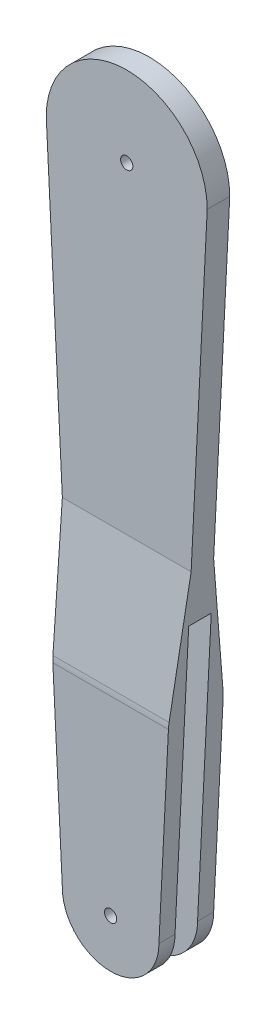
ISO-10303-21;
HEADER;
FILE_DESCRIPTION(('STEP AP214'),'2;1');
FILE_NAME('part.step','',(''),(''),'','','');
FILE_SCHEMA(('AUTOMOTIVE_DESIGN { 1 0 10303 214 1 1 1 1 }'));
ENDSEC;
DATA;
#1=APPLICATION_CONTEXT('core data for automotive mechanical design processes');
#2=APPLICATION_PROTOCOL_DEFINITION('international standard','automotive_design',2000,#1);
#3=PRODUCT_CONTEXT('',#1,'mechanical');
#4=PRODUCT('Part','Part','',(#3));
#5=PRODUCT_RELATED_PRODUCT_CATEGORY('part','',(#4));
#6=PRODUCT_DEFINITION_FORMATION('','',#4);
#7=PRODUCT_DEFINITION_CONTEXT('part definition',#1,'design');
#8=PRODUCT_DEFINITION('design','',#6,#7);
#9=PRODUCT_DEFINITION_SHAPE('','',#8);
#10=(LENGTH_UNIT() NAMED_UNIT(*) SI_UNIT(.MILLI.,.METRE.));
#11=(NAMED_UNIT(*) PLANE_ANGLE_UNIT() SI_UNIT($,.RADIAN.));
#12=(NAMED_UNIT(*) SI_UNIT($,.STERADIAN.) SOLID_ANGLE_UNIT());
#13=UNCERTAINTY_MEASURE_WITH_UNIT(LENGTH_MEASURE(1.E-05),#10,'distance_accuracy_value','');
#14=(GEOMETRIC_REPRESENTATION_CONTEXT(3) GLOBAL_UNCERTAINTY_ASSIGNED_CONTEXT((#13)) GLOBAL_UNIT_ASSIGNED_CONTEXT((#10,
#11,#12)) REPRESENTATION_CONTEXT('',''));
#15=CARTESIAN_POINT('',(0.,0.,0.));
#16=DIRECTION('',(0.,0.,1.));
#17=DIRECTION('',(1.,0.,0.));
#18=AXIS2_PLACEMENT_3D('',#15,#16,#17);
#19=CARTESIAN_POINT('',(-24.9376558603491,-1.24688279301746,7.));
#20=DIRECTION('',(-0.998752338877845,-0.0499376169438922,0.));
#21=DIRECTION('',(0.0499376169438922,-0.998752338877845,0.));
#22=AXIS2_PLACEMENT_3D('',#19,#20,#21);
#23=PLANE('',#22);
#24=DIRECTION('',(0.,0.,-1.));
#25=VECTOR('',#24,1.);
#26=CARTESIAN_POINT('',(-15.,-200.,7.));
#27=LINE('',#26,#25);
#28=CARTESIAN_POINT('',(-15.,-200.,0.));
#29=VERTEX_POINT('',#28);
#30=CARTESIAN_POINT('',(-15.,-200.,-5.));
#31=VERTEX_POINT('',#30);
#32=EDGE_CURVE('E293',#29,#31,#27,.T.);
#33=ORIENTED_EDGE('',*,*,#32,.F.);
#34=DIRECTION('',(-0.0499376169438922,0.998752338877845,0.));
#35=VECTOR('',#34,1.);
#36=CARTESIAN_POINT('',(-24.9376558603491,-1.24688279301746,0.));
#37=LINE('',#36,#35);
#38=CARTESIAN_POINT('',(-19.25,-115.,0.));
#39=VERTEX_POINT('',#38);
#40=EDGE_CURVE('E225',#29,#39,#37,.T.);
#41=ORIENTED_EDGE('',*,*,#40,.T.);
#42=DIRECTION('',(0.,0.,1.));
#43=VECTOR('',#42,1.);
#44=CARTESIAN_POINT('',(-19.25,-115.,7.));
#45=LINE('',#44,#43);
#46=CARTESIAN_POINT('',(-19.25,-115.,7.));
#47=VERTEX_POINT('',#46);
#48=EDGE_CURVE('E217',#39,#47,#45,.T.);
#49=ORIENTED_EDGE('',*,*,#48,.T.);
#50=DIRECTION('',(0.0499376169438922,-0.998752338877845,0.));
#51=VECTOR('',#50,1.);
#52=CARTESIAN_POINT('',(-24.9376558603491,-1.24688279301746,7.));
#53=LINE('',#52,#51);
#54=CARTESIAN_POINT('',(-15.,-200.,7.));
#55=VERTEX_POINT('',#54);
#56=EDGE_CURVE('E204',#47,#55,#53,.T.);
#57=ORIENTED_EDGE('',*,*,#56,.T.);
#58=CARTESIAN_POINT('',(-15.,-200.,12.));
#59=VERTEX_POINT('',#58);
#60=EDGE_CURVE('E302',#59,#55,#27,.T.);
#61=ORIENTED_EDGE('',*,*,#60,.F.);
#62=DIRECTION('',(0.0499376169438922,-0.998752338877845,0.));
#63=VECTOR('',#62,1.);
#64=CARTESIAN_POINT('',(-14.1620947630923,-216.758104738155,12.));
#65=LINE('',#64,#63);
#66=CARTESIAN_POINT('',(-17.9533066887761,-140.933866224478,12.));
#67=VERTEX_POINT('',#66);
#68=EDGE_CURVE('E126',#67,#59,#65,.T.);
#69=ORIENTED_EDGE('',*,*,#68,.F.);
#70=CARTESIAN_POINT('',(-17.9533066887761,-140.933866224478,-3.));
#71=DIRECTION('',(0.998752338877845,0.0499376169438922,0.));
#72=DIRECTION('',(-0.0499376169438922,0.998752338877845,0.));
#73=AXIS2_PLACEMENT_3D('',#70,#71,#72);
#74=ELLIPSE('',#73,15.0187382958756,15.);
#75=CARTESIAN_POINT('',(-18.046332739718,-139.07334520564,11.884168150705));
#76=VERTEX_POINT('',#75);
#77=EDGE_CURVE('E111',#67,#76,#74,.F.);
#78=ORIENTED_EDGE('',*,*,#77,.T.);
#79=DIRECTION('',(0.0495529430831444,-0.991058861662888,0.123882357707861));
#80=VECTOR('',#79,1.);
#81=CARTESIAN_POINT('',(-17.9042357274402,-141.915285451197,12.2394106813996));
#82=LINE('',#81,#80);
#83=CARTESIAN_POINT('',(-20.,-100.,7.));
#84=VERTEX_POINT('',#83);
#85=EDGE_CURVE('E227',#84,#76,#82,.T.);
#86=ORIENTED_EDGE('',*,*,#85,.F.);
#87=DIRECTION('',(-0.0499376169438922,0.998752338877845,0.));
#88=VECTOR('',#87,1.);
#89=CARTESIAN_POINT('',(-24.9376558603491,-1.24688279301746,7.));
#90=LINE('',#89,#88);
#91=CARTESIAN_POINT('',(-25.,0.,7.));
#92=VERTEX_POINT('',#91);
#93=EDGE_CURVE('E290',#84,#92,#90,.T.);
#94=ORIENTED_EDGE('',*,*,#93,.T.);
#95=DIRECTION('',(0.,0.,-1.));
#96=VECTOR('',#95,1.);
#97=CARTESIAN_POINT('',(-25.,0.,7.));
#98=LINE('',#97,#96);
#99=CARTESIAN_POINT('',(-25.,0.,0.));
#100=VERTEX_POINT('',#99);
#101=EDGE_CURVE('E305',#92,#100,#98,.T.);
#102=ORIENTED_EDGE('',*,*,#101,.T.);
#103=DIRECTION('',(-0.0499376169438922,0.998752338877845,0.));
#104=VECTOR('',#103,1.);
#105=CARTESIAN_POINT('',(-24.9376558603491,-1.24688279301746,0.));
#106=LINE('',#105,#104);
#107=CARTESIAN_POINT('',(-20.,-100.,0.));
#108=VERTEX_POINT('',#107);
#109=EDGE_CURVE('E286',#108,#100,#106,.T.);
#110=ORIENTED_EDGE('',*,*,#109,.F.);
#111=DIRECTION('',(-0.0495529430831444,0.991058861662888,0.123882357707861));
#112=VECTOR('',#111,1.);
#113=CARTESIAN_POINT('',(-17.9042357274402,-141.915285451197,-5.23941068139963));
#114=LINE('',#113,#112);
#115=CARTESIAN_POINT('',(-18.046332739718,-139.07334520564,-4.88416815070502));
#116=VERTEX_POINT('',#115);
#117=EDGE_CURVE('E250',#116,#108,#114,.T.);
#118=ORIENTED_EDGE('',*,*,#117,.F.);
#119=CARTESIAN_POINT('',(-17.9533066887761,-140.933866224478,10.));
#120=DIRECTION('',(-0.998752338877845,-0.0499376169438922,0.));
#121=DIRECTION('',(-0.0499376169438922,0.998752338877845,0.));
#122=AXIS2_PLACEMENT_3D('',#119,#120,#121);
#123=ELLIPSE('',#122,15.0187382958756,15.);
#124=CARTESIAN_POINT('',(-17.9533066887761,-140.933866224478,-5.));
#125=VERTEX_POINT('',#124);
#126=EDGE_CURVE('E320',#116,#125,#123,.T.);
#127=ORIENTED_EDGE('',*,*,#126,.T.);
#128=DIRECTION('',(-0.0499376169438922,0.998752338877845,0.));
#129=VECTOR('',#128,1.);
#130=CARTESIAN_POINT('',(-14.1620947630923,-216.758104738155,-5.));
#131=LINE('',#130,#129);
#132=EDGE_CURVE('E259',#31,#125,#131,.T.);
#133=ORIENTED_EDGE('',*,*,#132,.F.);
#134=EDGE_LOOP('',(#33,#41,#49,#57,#61,#69,#78,#86,#94,#102,#110,#118,#127,#133));
#135=FACE_BOUND('',#134,.T.);
#136=ADVANCED_FACE('F101',(#135),#23,.T.);
#137=CARTESIAN_POINT('',(24.9376558603491,-1.24688279301746,7.));
#138=DIRECTION('',(-0.998752338877845,0.0499376169438923,0.));
#139=DIRECTION('',(-0.0499376169438923,-0.998752338877845,0.));
#140=AXIS2_PLACEMENT_3D('',#137,#138,#139);
#141=PLANE('',#140);
#142=DIRECTION('',(0.0499376169438923,0.998752338877845,0.));
#143=VECTOR('',#142,1.);
#144=CARTESIAN_POINT('',(24.9376558603491,-1.24688279301746,0.));
#145=LINE('',#144,#143);
#146=CARTESIAN_POINT('',(15.,-200.,0.));
#147=VERTEX_POINT('',#146);
#148=CARTESIAN_POINT('',(19.25,-115.,0.));
#149=VERTEX_POINT('',#148);
#150=EDGE_CURVE('E233',#147,#149,#145,.T.);
#151=ORIENTED_EDGE('',*,*,#150,.F.);
#152=DIRECTION('',(0.,0.,-1.));
#153=VECTOR('',#152,1.);
#154=CARTESIAN_POINT('',(15.,-200.,7.));
#155=LINE('',#154,#153);
#156=CARTESIAN_POINT('',(15.,-200.,-5.));
#157=VERTEX_POINT('',#156);
#158=EDGE_CURVE('E313',#147,#157,#155,.T.);
#159=ORIENTED_EDGE('',*,*,#158,.T.);
#160=DIRECTION('',(-0.0499376169438923,-0.998752338877845,0.));
#161=VECTOR('',#160,1.);
#162=CARTESIAN_POINT('',(14.2668329177057,-214.663341645885,-5.));
#163=LINE('',#162,#161);
#164=CARTESIAN_POINT('',(17.9533066887761,-140.933866224478,-5.));
#165=VERTEX_POINT('',#164);
#166=EDGE_CURVE('E267',#165,#157,#163,.T.);
#167=ORIENTED_EDGE('',*,*,#166,.F.);
#168=CARTESIAN_POINT('',(17.9533066887761,-140.933866224478,10.));
#169=DIRECTION('',(-0.998752338877845,0.0499376169438923,0.));
#170=DIRECTION('',(-0.0499376169438923,-0.998752338877845,0.));
#171=AXIS2_PLACEMENT_3D('',#168,#169,#170);
#172=ELLIPSE('',#171,15.0187382958756,15.);
#173=CARTESIAN_POINT('',(18.046332739718,-139.07334520564,-4.88416815070502));
#174=VERTEX_POINT('',#173);
#175=EDGE_CURVE('E256',#165,#174,#172,.F.);
#176=ORIENTED_EDGE('',*,*,#175,.T.);
#177=DIRECTION('',(-0.0495529430831445,-0.991058861662888,-0.123882357707861));
#178=VECTOR('',#177,1.);
#179=CARTESIAN_POINT('',(18.0073664825046,-139.852670349908,-4.98158379373849));
#180=LINE('',#179,#178);
#181=CARTESIAN_POINT('',(20.,-100.,0.));
#182=VERTEX_POINT('',#181);
#183=EDGE_CURVE('E263',#182,#174,#180,.T.);
#184=ORIENTED_EDGE('',*,*,#183,.F.);
#185=DIRECTION('',(0.0499376169438923,0.998752338877845,0.));
#186=VECTOR('',#185,1.);
#187=CARTESIAN_POINT('',(24.9376558603491,-1.24688279301746,0.));
#188=LINE('',#187,#186);
#189=CARTESIAN_POINT('',(25.,0.,0.));
#190=VERTEX_POINT('',#189);
#191=EDGE_CURVE('E275',#182,#190,#188,.T.);
#192=ORIENTED_EDGE('',*,*,#191,.T.);
#193=DIRECTION('',(0.,0.,-1.));
#194=VECTOR('',#193,1.);
#195=CARTESIAN_POINT('',(25.,0.,7.));
#196=LINE('',#195,#194);
#197=CARTESIAN_POINT('',(25.,0.,7.));
#198=VERTEX_POINT('',#197);
#199=EDGE_CURVE('E309',#198,#190,#196,.T.);
#200=ORIENTED_EDGE('',*,*,#199,.F.);
#201=DIRECTION('',(0.0499376169438923,0.998752338877845,0.));
#202=VECTOR('',#201,1.);
#203=CARTESIAN_POINT('',(24.9376558603491,-1.24688279301746,7.));
#204=LINE('',#203,#202);
#205=CARTESIAN_POINT('',(20.,-100.,7.));
#206=VERTEX_POINT('',#205);
#207=EDGE_CURVE('E282',#206,#198,#204,.T.);
#208=ORIENTED_EDGE('',*,*,#207,.F.);
#209=DIRECTION('',(0.0495529430831445,0.991058861662888,-0.123882357707861));
#210=VECTOR('',#209,1.);
#211=CARTESIAN_POINT('',(18.0073664825046,-139.852670349908,11.9815837937385));
#212=LINE('',#211,#210);
#213=CARTESIAN_POINT('',(18.046332739718,-139.07334520564,11.884168150705));
#214=VERTEX_POINT('',#213);
#215=EDGE_CURVE('E243',#214,#206,#212,.T.);
#216=ORIENTED_EDGE('',*,*,#215,.F.);
#217=CARTESIAN_POINT('',(17.9533066887761,-140.933866224478,-3.));
#218=DIRECTION('',(-0.998752338877845,0.0499376169438923,0.));
#219=DIRECTION('',(-0.0499376169438923,-0.998752338877845,0.));
#220=AXIS2_PLACEMENT_3D('',#217,#218,#219);
#221=ELLIPSE('',#220,15.0187382958756,15.);
#222=CARTESIAN_POINT('',(17.9533066887761,-140.933866224478,12.));
#223=VERTEX_POINT('',#222);
#224=EDGE_CURVE('E334',#214,#223,#221,.F.);
#225=ORIENTED_EDGE('',*,*,#224,.T.);
#226=DIRECTION('',(0.0499376169438923,0.998752338877845,0.));
#227=VECTOR('',#226,1.);
#228=CARTESIAN_POINT('',(14.2668329177057,-214.663341645885,12.));
#229=LINE('',#228,#227);
#230=CARTESIAN_POINT('',(15.,-200.,12.));
#231=VERTEX_POINT('',#230);
#232=EDGE_CURVE('E239',#231,#223,#229,.T.);
#233=ORIENTED_EDGE('',*,*,#232,.F.);
#234=CARTESIAN_POINT('',(15.,-200.,7.));
#235=VERTEX_POINT('',#234);
#236=EDGE_CURVE('E281',#231,#235,#155,.T.);
#237=ORIENTED_EDGE('',*,*,#236,.T.);
#238=DIRECTION('',(-0.0499376169438923,-0.998752338877845,0.));
#239=VECTOR('',#238,1.);
#240=CARTESIAN_POINT('',(24.9376558603491,-1.24688279301746,7.));
#241=LINE('',#240,#239);
#242=CARTESIAN_POINT('',(19.25,-115.,7.));
#243=VERTEX_POINT('',#242);
#244=EDGE_CURVE('E212',#243,#235,#241,.T.);
#245=ORIENTED_EDGE('',*,*,#244,.F.);
#246=DIRECTION('',(0.,0.,1.));
#247=VECTOR('',#246,1.);
#248=CARTESIAN_POINT('',(19.25,-115.,7.));
#249=LINE('',#248,#247);
#250=EDGE_CURVE('E12',#149,#243,#249,.T.);
#251=ORIENTED_EDGE('',*,*,#250,.F.);
#252=EDGE_LOOP('',(#151,#159,#167,#176,#184,#192,#200,#208,#216,#225,#233,#237,#245,#251));
#253=FACE_BOUND('',#252,.T.);
#254=ADVANCED_FACE('F350',(#253),#141,.F.);
#255=CARTESIAN_POINT('',(0.,-200.,7.));
#256=DIRECTION('',(0.,0.,-1.));
#257=DIRECTION('',(-1.,0.,0.));
#258=AXIS2_PLACEMENT_3D('',#255,#256,#257);
#259=CYLINDRICAL_SURFACE('',#258,15.);
#260=ORIENTED_EDGE('',*,*,#158,.F.);
#261=CARTESIAN_POINT('',(0.,-200.,0.));
#262=DIRECTION('',(0.,0.,1.));
#263=DIRECTION('',(1.,0.,0.));
#264=AXIS2_PLACEMENT_3D('',#261,#262,#263);
#265=CIRCLE('',#264,15.);
#266=EDGE_CURVE('E211',#29,#147,#265,.T.);
#267=ORIENTED_EDGE('',*,*,#266,.F.);
#268=ORIENTED_EDGE('',*,*,#32,.T.);
#269=CARTESIAN_POINT('',(0.,-200.,-5.));
#270=DIRECTION('',(0.,0.,-1.));
#271=DIRECTION('',(0.,1.,0.));
#272=AXIS2_PLACEMENT_3D('',#269,#270,#271);
#273=CIRCLE('',#272,15.);
#274=EDGE_CURVE('E271',#157,#31,#273,.T.);
#275=ORIENTED_EDGE('',*,*,#274,.F.);
#276=EDGE_LOOP('',(#260,#267,#268,#275));
#277=FACE_BOUND('',#276,.T.);
#278=ADVANCED_FACE('F410',(#277),#259,.T.);
#279=CARTESIAN_POINT('',(0.,-200.,7.));
#280=DIRECTION('',(0.,0.,-1.));
#281=DIRECTION('',(-1.,0.,0.));
#282=AXIS2_PLACEMENT_3D('',#279,#280,#281);
#283=CIRCLE('',#282,15.);
#284=EDGE_CURVE('E118',#235,#55,#283,.T.);
#285=ORIENTED_EDGE('',*,*,#284,.F.);
#286=ORIENTED_EDGE('',*,*,#236,.F.);
#287=CARTESIAN_POINT('',(0.,-200.,12.));
#288=DIRECTION('',(0.,0.,-1.));
#289=DIRECTION('',(0.,1.,0.));
#290=AXIS2_PLACEMENT_3D('',#287,#288,#289);
#291=CIRCLE('',#290,15.);
#292=EDGE_CURVE('E246',#59,#231,#291,.F.);
#293=ORIENTED_EDGE('',*,*,#292,.F.);
#294=ORIENTED_EDGE('',*,*,#60,.T.);
#295=EDGE_LOOP('',(#285,#286,#293,#294));
#296=FACE_BOUND('',#295,.T.);
#297=ADVANCED_FACE('F354',(#296),#259,.T.);
#298=CARTESIAN_POINT('',(21.,-215.,12.));
#299=DIRECTION('',(0.,0.,-1.));
#300=DIRECTION('',(0.,1.,0.));
#301=AXIS2_PLACEMENT_3D('',#298,#299,#300);
#302=PLANE('',#301);
#303=CARTESIAN_POINT('',(0.,-200.,12.));
#304=DIRECTION('',(0.,0.,-1.));
#305=DIRECTION('',(0.,1.,0.));
#306=AXIS2_PLACEMENT_3D('',#303,#304,#305);
#307=CIRCLE('',#306,1.90000000000001);
#308=CARTESIAN_POINT('',(0.,-198.1,12.));
#309=VERTEX_POINT('',#308);
#310=EDGE_CURVE('E367',#309,#309,#307,.T.);
#311=ORIENTED_EDGE('',*,*,#310,.T.);
#312=EDGE_LOOP('',(#311));
#313=FACE_BOUND('',#312,.T.);
#314=ORIENTED_EDGE('',*,*,#68,.T.);
#315=ORIENTED_EDGE('',*,*,#292,.T.);
#316=ORIENTED_EDGE('',*,*,#232,.T.);
#317=DIRECTION('',(-1.,0.,0.));
#318=VECTOR('',#317,1.);
#319=CARTESIAN_POINT('',(21.,-140.933866224478,12.));
#320=LINE('',#319,#318);
#321=EDGE_CURVE('E255',#223,#67,#320,.T.);
#322=ORIENTED_EDGE('',*,*,#321,.T.);
#323=EDGE_LOOP('',(#314,#315,#316,#322));
#324=FACE_BOUND('',#323,.T.);
#325=ADVANCED_FACE('F353',(#313,#324),#302,.F.);
#326=CARTESIAN_POINT('',(21.,-140.,12.));
#327=DIRECTION('',(0.,-0.124034734589208,-0.992277876713668));
#328=DIRECTION('',(0.,0.992277876713668,-0.124034734589208));
#329=AXIS2_PLACEMENT_3D('',#326,#327,#328);
#330=PLANE('',#329);
#331=DIRECTION('',(-1.,0.,0.));
#332=VECTOR('',#331,1.);
#333=CARTESIAN_POINT('',(21.,-100.,7.));
#334=LINE('',#333,#332);
#335=EDGE_CURVE('E251',#206,#84,#334,.T.);
#336=ORIENTED_EDGE('',*,*,#335,.T.);
#337=ORIENTED_EDGE('',*,*,#85,.T.);
#338=DIRECTION('',(-1.,0.,0.));
#339=VECTOR('',#338,1.);
#340=CARTESIAN_POINT('',(21.,-139.07334520564,11.884168150705));
#341=LINE('',#340,#339);
#342=EDGE_CURVE('E331',#76,#214,#341,.F.);
#343=ORIENTED_EDGE('',*,*,#342,.T.);
#344=ORIENTED_EDGE('',*,*,#215,.T.);
#345=EDGE_LOOP('',(#336,#337,#343,#344));
#346=FACE_BOUND('',#345,.T.);
#347=ADVANCED_FACE('F343',(#346),#330,.F.);
#348=CARTESIAN_POINT('',(0.,0.,0.));
#349=DIRECTION('',(0.,0.,1.));
#350=DIRECTION('',(1.,0.,0.));
#351=AXIS2_PLACEMENT_3D('',#348,#349,#350);
#352=PLANE('',#351);
#353=CARTESIAN_POINT('',(0.,0.,0.));
#354=DIRECTION('',(0.,0.,-1.));
#355=DIRECTION('',(-1.,0.,0.));
#356=AXIS2_PLACEMENT_3D('',#353,#354,#355);
#357=CIRCLE('',#356,1.9);
#358=CARTESIAN_POINT('',(-1.9,0.,0.));
#359=VERTEX_POINT('',#358);
#360=EDGE_CURVE('E381',#359,#359,#357,.T.);
#361=ORIENTED_EDGE('',*,*,#360,.F.);
#362=EDGE_LOOP('',(#361));
#363=FACE_BOUND('',#362,.T.);
#364=ORIENTED_EDGE('',*,*,#191,.F.);
#365=DIRECTION('',(-1.,0.,0.));
#366=VECTOR('',#365,1.);
#367=CARTESIAN_POINT('',(21.,-100.,0.));
#368=LINE('',#367,#366);
#369=EDGE_CURVE('E276',#182,#108,#368,.T.);
#370=ORIENTED_EDGE('',*,*,#369,.T.);
#371=ORIENTED_EDGE('',*,*,#109,.T.);
#372=CARTESIAN_POINT('',(0.,0.,0.));
#373=DIRECTION('',(0.,0.,1.));
#374=DIRECTION('',(1.,0.,0.));
#375=AXIS2_PLACEMENT_3D('',#372,#373,#374);
#376=CIRCLE('',#375,25.);
#377=EDGE_CURVE('E296',#190,#100,#376,.T.);
#378=ORIENTED_EDGE('',*,*,#377,.F.);
#379=EDGE_LOOP('',(#364,#370,#371,#378));
#380=FACE_BOUND('',#379,.T.);
#381=ADVANCED_FACE('F408',(#363,#380),#352,.F.);
#382=CARTESIAN_POINT('',(21.,-215.,-5.));
#383=DIRECTION('',(0.,0.,-1.));
#384=DIRECTION('',(0.,1.,0.));
#385=AXIS2_PLACEMENT_3D('',#382,#383,#384);
#386=PLANE('',#385);
#387=CARTESIAN_POINT('',(0.,-200.,-5.));
#388=DIRECTION('',(0.,0.,-1.));
#389=DIRECTION('',(0.,1.,0.));
#390=AXIS2_PLACEMENT_3D('',#387,#388,#389);
#391=CIRCLE('',#390,1.90000000000001);
#392=CARTESIAN_POINT('',(0.,-198.1,-5.));
#393=VERTEX_POINT('',#392);
#394=EDGE_CURVE('E371',#393,#393,#391,.T.);
#395=ORIENTED_EDGE('',*,*,#394,.F.);
#396=EDGE_LOOP('',(#395));
#397=FACE_BOUND('',#396,.T.);
#398=ORIENTED_EDGE('',*,*,#132,.T.);
#399=DIRECTION('',(-1.,0.,0.));
#400=VECTOR('',#399,1.);
#401=CARTESIAN_POINT('',(21.,-140.933866224478,-5.));
#402=LINE('',#401,#400);
#403=EDGE_CURVE('E323',#125,#165,#402,.F.);
#404=ORIENTED_EDGE('',*,*,#403,.T.);
#405=ORIENTED_EDGE('',*,*,#166,.T.);
#406=ORIENTED_EDGE('',*,*,#274,.T.);
#407=EDGE_LOOP('',(#398,#404,#405,#406));
#408=FACE_BOUND('',#407,.T.);
#409=ADVANCED_FACE('F431',(#397,#408),#386,.T.);
#410=CARTESIAN_POINT('',(21.,-140.933866224478,10.));
#411=DIRECTION('',(-1.,0.,0.));
#412=DIRECTION('',(0.,-1.,0.));
#413=AXIS2_PLACEMENT_3D('',#410,#411,#412);
#414=CYLINDRICAL_SURFACE('',#413,15.);
#415=ORIENTED_EDGE('',*,*,#175,.F.);
#416=ORIENTED_EDGE('',*,*,#403,.F.);
#417=ORIENTED_EDGE('',*,*,#126,.F.);
#418=DIRECTION('',(-1.,0.,0.));
#419=VECTOR('',#418,1.);
#420=CARTESIAN_POINT('',(21.,-139.07334520564,-4.88416815070501));
#421=LINE('',#420,#419);
#422=EDGE_CURVE('E280',#174,#116,#421,.T.);
#423=ORIENTED_EDGE('',*,*,#422,.F.);
#424=EDGE_LOOP('',(#415,#416,#417,#423));
#425=FACE_BOUND('',#424,.T.);
#426=ADVANCED_FACE('F429',(#425),#414,.T.);
#427=CARTESIAN_POINT('',(21.,-140.,-5.));
#428=DIRECTION('',(0.,0.124034734589208,-0.992277876713668));
#429=DIRECTION('',(0.,0.992277876713668,0.124034734589208));
#430=AXIS2_PLACEMENT_3D('',#427,#428,#429);
#431=PLANE('',#430);
#432=ORIENTED_EDGE('',*,*,#183,.T.);
#433=ORIENTED_EDGE('',*,*,#422,.T.);
#434=ORIENTED_EDGE('',*,*,#117,.T.);
#435=ORIENTED_EDGE('',*,*,#369,.F.);
#436=EDGE_LOOP('',(#432,#433,#434,#435));
#437=FACE_BOUND('',#436,.T.);
#438=ADVANCED_FACE('F425',(#437),#431,.T.);
#439=CARTESIAN_POINT('',(0.,0.,7.));
#440=DIRECTION('',(0.,0.,-1.));
#441=DIRECTION('',(-1.,0.,0.));
#442=AXIS2_PLACEMENT_3D('',#439,#440,#441);
#443=CYLINDRICAL_SURFACE('',#442,25.);
#444=ORIENTED_EDGE('',*,*,#377,.T.);
#445=ORIENTED_EDGE('',*,*,#101,.F.);
#446=CARTESIAN_POINT('',(0.,0.,7.));
#447=DIRECTION('',(0.,0.,1.));
#448=DIRECTION('',(1.,0.,0.));
#449=AXIS2_PLACEMENT_3D('',#446,#447,#448);
#450=CIRCLE('',#449,25.);
#451=EDGE_CURVE('E285',#198,#92,#450,.T.);
#452=ORIENTED_EDGE('',*,*,#451,.F.);
#453=ORIENTED_EDGE('',*,*,#199,.T.);
#454=EDGE_LOOP('',(#444,#445,#452,#453));
#455=FACE_BOUND('',#454,.T.);
#456=ADVANCED_FACE('F422',(#455),#443,.T.);
#457=CARTESIAN_POINT('',(0.,0.,7.));
#458=DIRECTION('',(0.,0.,1.));
#459=DIRECTION('',(1.,0.,0.));
#460=AXIS2_PLACEMENT_3D('',#457,#458,#459);
#461=PLANE('',#460);
#462=CARTESIAN_POINT('',(0.,0.,6.99999999999999));
#463=DIRECTION('',(0.,0.,-1.));
#464=DIRECTION('',(-1.,0.,0.));
#465=AXIS2_PLACEMENT_3D('',#462,#463,#464);
#466=CIRCLE('',#465,1.9);
#467=CARTESIAN_POINT('',(-1.9,0.,6.99999999999999));
#468=VERTEX_POINT('',#467);
#469=EDGE_CURVE('E385',#468,#468,#466,.T.);
#470=ORIENTED_EDGE('',*,*,#469,.T.);
#471=EDGE_LOOP('',(#470));
#472=FACE_BOUND('',#471,.T.);
#473=ORIENTED_EDGE('',*,*,#335,.F.);
#474=ORIENTED_EDGE('',*,*,#207,.T.);
#475=ORIENTED_EDGE('',*,*,#451,.T.);
#476=ORIENTED_EDGE('',*,*,#93,.F.);
#477=EDGE_LOOP('',(#473,#474,#475,#476));
#478=FACE_BOUND('',#477,.T.);
#479=ADVANCED_FACE('F424',(#472,#478),#461,.T.);
#480=CARTESIAN_POINT('',(21.,-140.933866224478,-3.));
#481=DIRECTION('',(-1.,0.,0.));
#482=DIRECTION('',(0.,-1.,0.));
#483=AXIS2_PLACEMENT_3D('',#480,#481,#482);
#484=CYLINDRICAL_SURFACE('',#483,15.);
#485=ORIENTED_EDGE('',*,*,#77,.F.);
#486=ORIENTED_EDGE('',*,*,#321,.F.);
#487=ORIENTED_EDGE('',*,*,#224,.F.);
#488=ORIENTED_EDGE('',*,*,#342,.F.);
#489=EDGE_LOOP('',(#485,#486,#487,#488));
#490=FACE_BOUND('',#489,.T.);
#491=ADVANCED_FACE('F103',(#490),#484,.T.);
#492=CARTESIAN_POINT('',(-24.5,-115.,0.));
#493=DIRECTION('',(0.,-1.,0.));
#494=DIRECTION('',(1.,0.,0.));
#495=AXIS2_PLACEMENT_3D('',#492,#493,#494);
#496=PLANE('',#495);
#497=DIRECTION('',(1.,0.,0.));
#498=VECTOR('',#497,1.);
#499=CARTESIAN_POINT('',(-24.5,-115.,0.));
#500=LINE('',#499,#498);
#501=EDGE_CURVE('E221',#39,#149,#500,.T.);
#502=ORIENTED_EDGE('',*,*,#501,.T.);
#503=ORIENTED_EDGE('',*,*,#250,.T.);
#504=DIRECTION('',(1.,0.,0.));
#505=VECTOR('',#504,1.);
#506=CARTESIAN_POINT('',(-24.5,-115.,7.));
#507=LINE('',#506,#505);
#508=EDGE_CURVE('E207',#47,#243,#507,.T.);
#509=ORIENTED_EDGE('',*,*,#508,.F.);
#510=ORIENTED_EDGE('',*,*,#48,.F.);
#511=EDGE_LOOP('',(#502,#503,#509,#510));
#512=FACE_BOUND('',#511,.T.);
#513=ADVANCED_FACE('F216',(#512),#496,.T.);
#514=CARTESIAN_POINT('',(21.,-200.,0.));
#515=DIRECTION('',(0.,0.,1.));
#516=DIRECTION('',(1.,0.,0.));
#517=AXIS2_PLACEMENT_3D('',#514,#515,#516);
#518=PLANE('',#517);
#519=CARTESIAN_POINT('',(0.,-200.,0.));
#520=DIRECTION('',(0.,0.,1.));
#521=DIRECTION('',(1.,0.,0.));
#522=AXIS2_PLACEMENT_3D('',#519,#520,#521);
#523=CIRCLE('',#522,1.90000000000001);
#524=CARTESIAN_POINT('',(1.9,-200.,0.));
#525=VERTEX_POINT('',#524);
#526=EDGE_CURVE('E377',#525,#525,#523,.T.);
#527=ORIENTED_EDGE('',*,*,#526,.F.);
#528=EDGE_LOOP('',(#527));
#529=FACE_BOUND('',#528,.T.);
#530=ORIENTED_EDGE('',*,*,#266,.T.);
#531=ORIENTED_EDGE('',*,*,#150,.T.);
#532=ORIENTED_EDGE('',*,*,#501,.F.);
#533=ORIENTED_EDGE('',*,*,#40,.F.);
#534=EDGE_LOOP('',(#530,#531,#532,#533));
#535=FACE_BOUND('',#534,.T.);
#536=ADVANCED_FACE('F363',(#529,#535),#518,.T.);
#537=CARTESIAN_POINT('',(21.,-200.,7.));
#538=DIRECTION('',(0.,0.,1.));
#539=DIRECTION('',(1.,0.,0.));
#540=AXIS2_PLACEMENT_3D('',#537,#538,#539);
#541=PLANE('',#540);
#542=CARTESIAN_POINT('',(0.,-200.,7.));
#543=DIRECTION('',(0.,0.,1.));
#544=DIRECTION('',(1.,0.,0.));
#545=AXIS2_PLACEMENT_3D('',#542,#543,#544);
#546=CIRCLE('',#545,1.90000000000001);
#547=CARTESIAN_POINT('',(1.9,-200.,7.));
#548=VERTEX_POINT('',#547);
#549=EDGE_CURVE('E105',#548,#548,#546,.T.);
#550=ORIENTED_EDGE('',*,*,#549,.T.);
#551=EDGE_LOOP('',(#550));
#552=FACE_BOUND('',#551,.T.);
#553=ORIENTED_EDGE('',*,*,#508,.T.);
#554=ORIENTED_EDGE('',*,*,#244,.T.);
#555=ORIENTED_EDGE('',*,*,#284,.T.);
#556=ORIENTED_EDGE('',*,*,#56,.F.);
#557=EDGE_LOOP('',(#553,#554,#555,#556));
#558=FACE_BOUND('',#557,.T.);
#559=ADVANCED_FACE('F206',(#552,#558),#541,.F.);
#560=CARTESIAN_POINT('',(0.,-200.,19.5));
#561=DIRECTION('',(0.,0.,-1.));
#562=DIRECTION('',(-1.,0.,0.));
#563=AXIS2_PLACEMENT_3D('',#560,#561,#562);
#564=CYLINDRICAL_SURFACE('',#563,1.90000000000001);
#565=ORIENTED_EDGE('',*,*,#549,.F.);
#566=EDGE_LOOP('',(#565));
#567=FACE_BOUND('',#566,.T.);
#568=ORIENTED_EDGE('',*,*,#310,.F.);
#569=EDGE_LOOP('',(#568));
#570=FACE_BOUND('',#569,.T.);
#571=ADVANCED_FACE('F395',(#567,#570),#564,.F.);
#572=ORIENTED_EDGE('',*,*,#394,.T.);
#573=EDGE_LOOP('',(#572));
#574=FACE_BOUND('',#573,.T.);
#575=ORIENTED_EDGE('',*,*,#526,.T.);
#576=EDGE_LOOP('',(#575));
#577=FACE_BOUND('',#576,.T.);
#578=ADVANCED_FACE('F398',(#574,#577),#564,.F.);
#579=CARTESIAN_POINT('',(0.,0.,6.99999999999999));
#580=DIRECTION('',(0.,0.,-1.));
#581=DIRECTION('',(-1.,0.,0.));
#582=AXIS2_PLACEMENT_3D('',#579,#580,#581);
#583=CYLINDRICAL_SURFACE('',#582,1.9);
#584=ORIENTED_EDGE('',*,*,#469,.F.);
#585=EDGE_LOOP('',(#584));
#586=FACE_BOUND('',#585,.T.);
#587=ORIENTED_EDGE('',*,*,#360,.T.);
#588=EDGE_LOOP('',(#587));
#589=FACE_BOUND('',#588,.T.);
#590=ADVANCED_FACE('F483',(#586,#589),#583,.F.);
#591=CLOSED_SHELL('',(#136,#254,#278,#297,#325,#347,#381,#409,#426,#438,#456,#479,#491,#513,
#536,#559,#571,#578,#590));
#592=MANIFOLD_SOLID_BREP('B2',#591);
#593=ADVANCED_BREP_SHAPE_REPRESENTATION('',(#18,#592),#14);
#594=SHAPE_DEFINITION_REPRESENTATION(#9,#593);
ENDSEC;
END-ISO-10303-21;
